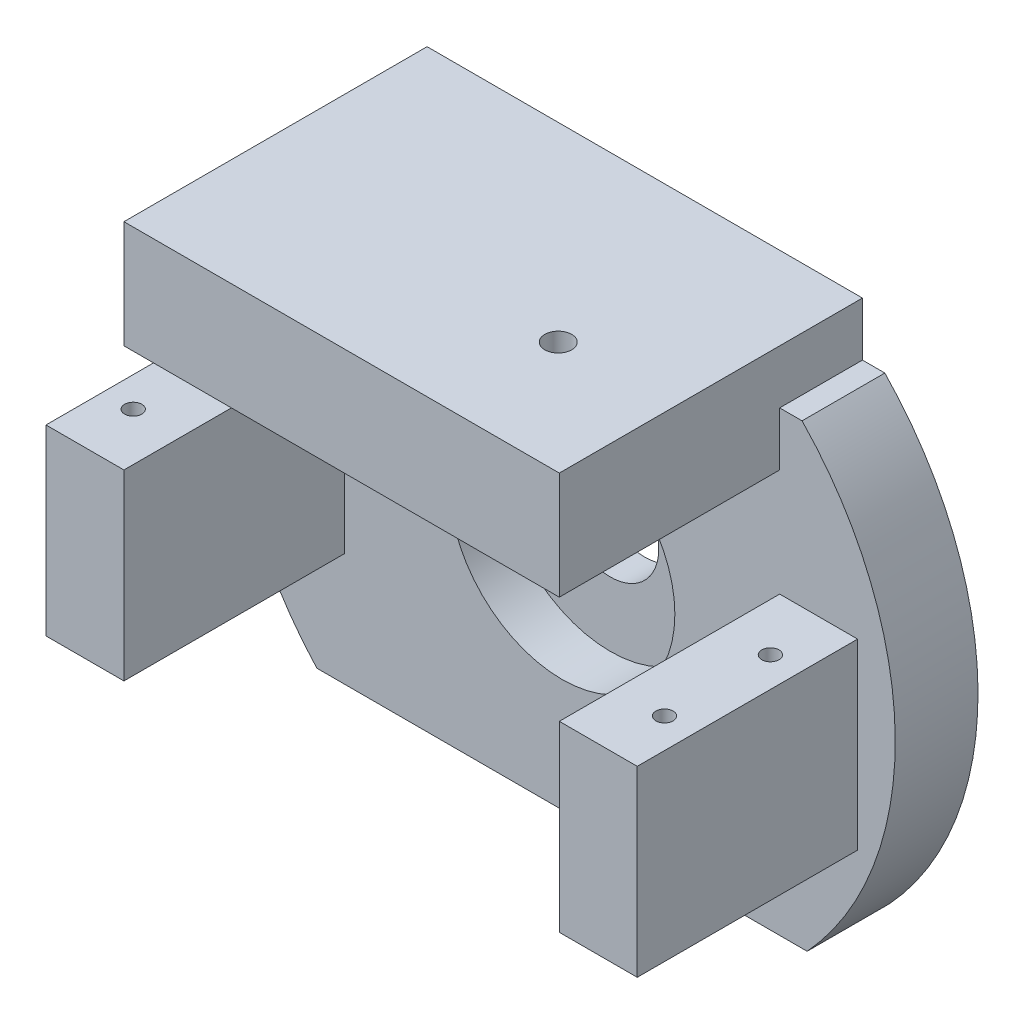
ISO-10303-21;
HEADER;
FILE_DESCRIPTION(('STEP AP214'),'2;1');
FILE_NAME('part.step','',(''),(''),'','','');
FILE_SCHEMA(('AUTOMOTIVE_DESIGN { 1 0 10303 214 1 1 1 1 }'));
ENDSEC;
DATA;
#1=APPLICATION_CONTEXT('core data for automotive mechanical design processes');
#2=APPLICATION_PROTOCOL_DEFINITION('international standard','automotive_design',2000,#1);
#3=PRODUCT_CONTEXT('',#1,'mechanical');
#4=PRODUCT('Part','Part','',(#3));
#5=PRODUCT_RELATED_PRODUCT_CATEGORY('part','',(#4));
#6=PRODUCT_DEFINITION_FORMATION('','',#4);
#7=PRODUCT_DEFINITION_CONTEXT('part definition',#1,'design');
#8=PRODUCT_DEFINITION('design','',#6,#7);
#9=PRODUCT_DEFINITION_SHAPE('','',#8);
#10=(LENGTH_UNIT() NAMED_UNIT(*) SI_UNIT(.MILLI.,.METRE.));
#11=(NAMED_UNIT(*) PLANE_ANGLE_UNIT() SI_UNIT($,.RADIAN.));
#12=(NAMED_UNIT(*) SI_UNIT($,.STERADIAN.) SOLID_ANGLE_UNIT());
#13=UNCERTAINTY_MEASURE_WITH_UNIT(LENGTH_MEASURE(1.E-05),#10,'distance_accuracy_value','');
#14=(GEOMETRIC_REPRESENTATION_CONTEXT(3) GLOBAL_UNCERTAINTY_ASSIGNED_CONTEXT((#13)) GLOBAL_UNIT_ASSIGNED_CONTEXT((#10,
#11,#12)) REPRESENTATION_CONTEXT('',''));
#15=CARTESIAN_POINT('',(0.,0.,0.));
#16=DIRECTION('',(0.,0.,1.));
#17=DIRECTION('',(1.,0.,0.));
#18=AXIS2_PLACEMENT_3D('',#15,#16,#17);
#19=CARTESIAN_POINT('',(-27.5,21.5,27.));
#20=DIRECTION('',(0.,-1.,0.));
#21=DIRECTION('',(0.,0.,-1.));
#22=AXIS2_PLACEMENT_3D('',#19,#20,#21);
#23=PLANE('',#22);
#24=DIRECTION('',(1.,0.,0.));
#25=VECTOR('',#24,1.);
#26=CARTESIAN_POINT('',(-26.0407931939076,21.5,6.5));
#27=LINE('',#26,#25);
#28=CARTESIAN_POINT('',(-22.3327114341273,21.5,6.50000000000001));
#29=VERTEX_POINT('',#28);
#30=CARTESIAN_POINT('',(-20.25,21.5,6.5));
#31=VERTEX_POINT('',#30);
#32=EDGE_CURVE('E180',#29,#31,#27,.T.);
#33=ORIENTED_EDGE('',*,*,#32,.T.);
#34=DIRECTION('',(0.,0.,1.));
#35=VECTOR('',#34,1.);
#36=CARTESIAN_POINT('',(-20.25,21.5,-1.2));
#37=LINE('',#36,#35);
#38=CARTESIAN_POINT('',(-20.25,21.5,-1.2));
#39=VERTEX_POINT('',#38);
#40=EDGE_CURVE('E168',#39,#31,#37,.T.);
#41=ORIENTED_EDGE('',*,*,#40,.F.);
#42=DIRECTION('',(1.,0.,0.));
#43=VECTOR('',#42,1.);
#44=CARTESIAN_POINT('',(22.3327114341273,21.5,-1.2));
#45=LINE('',#44,#43);
#46=CARTESIAN_POINT('',(-22.3327114341273,21.5,-1.2));
#47=VERTEX_POINT('',#46);
#48=EDGE_CURVE('E178',#47,#39,#45,.T.);
#49=ORIENTED_EDGE('',*,*,#48,.F.);
#50=DIRECTION('',(0.,0.,-1.));
#51=VECTOR('',#50,1.);
#52=CARTESIAN_POINT('',(-22.3327114341273,21.5,94.1812408671319));
#53=LINE('',#52,#51);
#54=EDGE_CURVE('E49',#47,#29,#53,.F.);
#55=ORIENTED_EDGE('',*,*,#54,.T.);
#56=EDGE_LOOP('',(#33,#41,#49,#55));
#57=FACE_BOUND('',#56,.T.);
#58=ADVANCED_FACE('F41',(#57),#23,.F.);
#59=CARTESIAN_POINT('',(0.,0.,94.1812408671319));
#60=DIRECTION('',(0.,0.,-1.));
#61=DIRECTION('',(-1.,0.,0.));
#62=AXIS2_PLACEMENT_3D('',#59,#60,#61);
#63=CYLINDRICAL_SURFACE('',#62,31.);
#64=DIRECTION('',(0.,0.,-1.));
#65=VECTOR('',#64,1.);
#66=CARTESIAN_POINT('',(-22.8035085019828,-21.,94.1812408671319));
#67=LINE('',#66,#65);
#68=CARTESIAN_POINT('',(-22.8035085019828,-21.,6.5));
#69=VERTEX_POINT('',#68);
#70=CARTESIAN_POINT('',(-22.8035085019828,-21.,-1.2));
#71=VERTEX_POINT('',#70);
#72=EDGE_CURVE('E63',#69,#71,#67,.T.);
#73=ORIENTED_EDGE('',*,*,#72,.F.);
#74=CARTESIAN_POINT('',(0.,0.,6.50000000000001));
#75=DIRECTION('',(0.,0.,-1.));
#76=DIRECTION('',(-1.,0.,0.));
#77=AXIS2_PLACEMENT_3D('',#74,#75,#76);
#78=CIRCLE('',#77,31.);
#79=EDGE_CURVE('E223',#29,#69,#78,.F.);
#80=ORIENTED_EDGE('',*,*,#79,.F.);
#81=ORIENTED_EDGE('',*,*,#54,.F.);
#82=CARTESIAN_POINT('',(0.,0.,-1.2));
#83=DIRECTION('',(0.,0.,-1.));
#84=DIRECTION('',(-1.,0.,0.));
#85=AXIS2_PLACEMENT_3D('',#82,#83,#84);
#86=CIRCLE('',#85,31.);
#87=EDGE_CURVE('E187',#71,#47,#86,.T.);
#88=ORIENTED_EDGE('',*,*,#87,.F.);
#89=EDGE_LOOP('',(#73,#80,#81,#88));
#90=FACE_BOUND('',#89,.T.);
#91=ADVANCED_FACE('F320',(#90),#63,.T.);
#92=CARTESIAN_POINT('',(-20.25,67.4360851344404,6.5));
#93=DIRECTION('',(0.,0.,-1.));
#94=DIRECTION('',(-1.,0.,0.));
#95=AXIS2_PLACEMENT_3D('',#92,#93,#94);
#96=PLANE('',#95);
#97=CARTESIAN_POINT('',(0.,0.,6.5));
#98=DIRECTION('',(0.,0.,1.));
#99=DIRECTION('',(1.,0.,0.));
#100=AXIS2_PLACEMENT_3D('',#97,#98,#99);
#101=CIRCLE('',#100,10.5);
#102=CARTESIAN_POINT('',(10.5,0.,6.5));
#103=VERTEX_POINT('',#102);
#104=EDGE_CURVE('E201',#103,#103,#101,.T.);
#105=ORIENTED_EDGE('',*,*,#104,.F.);
#106=EDGE_LOOP('',(#105));
#107=FACE_BOUND('',#106,.T.);
#108=DIRECTION('',(-1.,0.,0.));
#109=VECTOR('',#108,1.);
#110=CARTESIAN_POINT('',(50.3089894559141,6.50000000000001,6.5));
#111=LINE('',#110,#109);
#112=CARTESIAN_POINT('',(27.5,6.50000000000001,6.5));
#113=VERTEX_POINT('',#112);
#114=CARTESIAN_POINT('',(20.25,6.50000000000001,6.5));
#115=VERTEX_POINT('',#114);
#116=EDGE_CURVE('E254',#113,#115,#111,.T.);
#117=ORIENTED_EDGE('',*,*,#116,.F.);
#118=DIRECTION('',(0.,-1.,0.));
#119=VECTOR('',#118,1.);
#120=CARTESIAN_POINT('',(27.5,21.5,6.5));
#121=LINE('',#120,#119);
#122=CARTESIAN_POINT('',(27.5,-10.5,6.5));
#123=VERTEX_POINT('',#122);
#124=EDGE_CURVE('E226',#113,#123,#121,.T.);
#125=ORIENTED_EDGE('',*,*,#124,.T.);
#126=DIRECTION('',(-1.,0.,0.));
#127=VECTOR('',#126,1.);
#128=CARTESIAN_POINT('',(-27.5,-10.5,6.5));
#129=LINE('',#128,#127);
#130=CARTESIAN_POINT('',(20.25,-10.5,6.5));
#131=VERTEX_POINT('',#130);
#132=EDGE_CURVE('E275',#123,#131,#129,.T.);
#133=ORIENTED_EDGE('',*,*,#132,.T.);
#134=DIRECTION('',(0.,-1.,0.));
#135=VECTOR('',#134,1.);
#136=CARTESIAN_POINT('',(20.25,67.4360851344404,6.5));
#137=LINE('',#136,#135);
#138=EDGE_CURVE('E285',#115,#131,#137,.T.);
#139=ORIENTED_EDGE('',*,*,#138,.F.);
#140=EDGE_LOOP('',(#117,#125,#133,#139));
#141=FACE_BOUND('',#140,.T.);
#142=ORIENTED_EDGE('',*,*,#79,.T.);
#143=DIRECTION('',(-1.,0.,0.));
#144=VECTOR('',#143,1.);
#145=CARTESIAN_POINT('',(26.5027413784262,-21.,6.5));
#146=LINE('',#145,#144);
#147=CARTESIAN_POINT('',(22.8035085019828,-21.,6.5));
#148=VERTEX_POINT('',#147);
#149=EDGE_CURVE('E322',#148,#69,#146,.T.);
#150=ORIENTED_EDGE('',*,*,#149,.F.);
#151=CARTESIAN_POINT('',(22.3327114341273,21.5,6.50000000000001));
#152=VERTEX_POINT('',#151);
#153=EDGE_CURVE('E227',#148,#152,#78,.F.);
#154=ORIENTED_EDGE('',*,*,#153,.T.);
#155=CARTESIAN_POINT('',(20.25,21.5,6.5));
#156=VERTEX_POINT('',#155);
#157=EDGE_CURVE('E189',#156,#152,#27,.T.);
#158=ORIENTED_EDGE('',*,*,#157,.F.);
#159=DIRECTION('',(0.,-1.,0.));
#160=VECTOR('',#159,1.);
#161=CARTESIAN_POINT('',(20.25,43.2442521140645,6.5));
#162=LINE('',#161,#160);
#163=CARTESIAN_POINT('',(20.25,16.5,6.5));
#164=VERTEX_POINT('',#163);
#165=EDGE_CURVE('E243',#156,#164,#162,.T.);
#166=ORIENTED_EDGE('',*,*,#165,.T.);
#167=DIRECTION('',(-1.,0.,0.));
#168=VECTOR('',#167,1.);
#169=CARTESIAN_POINT('',(-20.25,16.5,6.5));
#170=LINE('',#169,#168);
#171=CARTESIAN_POINT('',(-20.25,16.5,6.5));
#172=VERTEX_POINT('',#171);
#173=EDGE_CURVE('E287',#164,#172,#170,.T.);
#174=ORIENTED_EDGE('',*,*,#173,.T.);
#175=DIRECTION('',(0.,-1.,0.));
#176=VECTOR('',#175,1.);
#177=CARTESIAN_POINT('',(-20.25,43.2442521140645,6.5));
#178=LINE('',#177,#176);
#179=EDGE_CURVE('E235',#31,#172,#178,.T.);
#180=ORIENTED_EDGE('',*,*,#179,.F.);
#181=ORIENTED_EDGE('',*,*,#32,.F.);
#182=EDGE_LOOP('',(#142,#150,#154,#158,#166,#174,#180,#181));
#183=FACE_BOUND('',#182,.T.);
#184=CARTESIAN_POINT('',(-20.25,-10.5,6.5));
#185=VERTEX_POINT('',#184);
#186=CARTESIAN_POINT('',(-27.5,-10.5,6.5));
#187=VERTEX_POINT('',#186);
#188=EDGE_CURVE('E274',#185,#187,#129,.T.);
#189=ORIENTED_EDGE('',*,*,#188,.T.);
#190=DIRECTION('',(0.,1.,0.));
#191=VECTOR('',#190,1.);
#192=CARTESIAN_POINT('',(-27.5,21.5,6.5));
#193=LINE('',#192,#191);
#194=CARTESIAN_POINT('',(-27.5,6.5,6.5));
#195=VERTEX_POINT('',#194);
#196=EDGE_CURVE('E230',#187,#195,#193,.T.);
#197=ORIENTED_EDGE('',*,*,#196,.T.);
#198=CARTESIAN_POINT('',(-20.25,6.5,6.5));
#199=VERTEX_POINT('',#198);
#200=EDGE_CURVE('E248',#199,#195,#111,.T.);
#201=ORIENTED_EDGE('',*,*,#200,.F.);
#202=DIRECTION('',(0.,-1.,0.));
#203=VECTOR('',#202,1.);
#204=CARTESIAN_POINT('',(-20.25,67.4360851344404,6.5));
#205=LINE('',#204,#203);
#206=EDGE_CURVE('E284',#199,#185,#205,.T.);
#207=ORIENTED_EDGE('',*,*,#206,.T.);
#208=EDGE_LOOP('',(#189,#197,#201,#207));
#209=FACE_BOUND('',#208,.T.);
#210=ADVANCED_FACE('F317',(#107,#141,#183,#209),#96,.F.);
#211=CARTESIAN_POINT('',(27.5,21.5,27.));
#212=DIRECTION('',(-1.,0.,0.));
#213=DIRECTION('',(0.,-1.,0.));
#214=AXIS2_PLACEMENT_3D('',#211,#212,#213);
#215=PLANE('',#214);
#216=ORIENTED_EDGE('',*,*,#124,.F.);
#217=DIRECTION('',(0.,0.,-1.));
#218=VECTOR('',#217,1.);
#219=CARTESIAN_POINT('',(27.5,6.50000000000001,6.5));
#220=LINE('',#219,#218);
#221=CARTESIAN_POINT('',(27.5,6.50000000000001,27.));
#222=VERTEX_POINT('',#221);
#223=EDGE_CURVE('E252',#222,#113,#220,.T.);
#224=ORIENTED_EDGE('',*,*,#223,.F.);
#225=DIRECTION('',(0.,1.,0.));
#226=VECTOR('',#225,1.);
#227=CARTESIAN_POINT('',(27.5,21.5,27.));
#228=LINE('',#227,#226);
#229=CARTESIAN_POINT('',(27.5,-10.5,27.));
#230=VERTEX_POINT('',#229);
#231=EDGE_CURVE('E291',#230,#222,#228,.T.);
#232=ORIENTED_EDGE('',*,*,#231,.F.);
#233=DIRECTION('',(0.,0.,-1.));
#234=VECTOR('',#233,1.);
#235=CARTESIAN_POINT('',(27.5,-10.5,27.));
#236=LINE('',#235,#234);
#237=EDGE_CURVE('E264',#230,#123,#236,.T.);
#238=ORIENTED_EDGE('',*,*,#237,.T.);
#239=EDGE_LOOP('',(#216,#224,#232,#238));
#240=FACE_BOUND('',#239,.T.);
#241=ADVANCED_FACE('F43',(#240),#215,.F.);
#242=CARTESIAN_POINT('',(20.25,21.5,-1.2));
#243=VERTEX_POINT('',#242);
#244=CARTESIAN_POINT('',(22.3327114341273,21.5,-1.2));
#245=VERTEX_POINT('',#244);
#246=EDGE_CURVE('E190',#243,#245,#45,.T.);
#247=ORIENTED_EDGE('',*,*,#246,.F.);
#248=DIRECTION('',(0.,0.,1.));
#249=VECTOR('',#248,1.);
#250=CARTESIAN_POINT('',(20.25,21.5,-1.2));
#251=LINE('',#250,#249);
#252=EDGE_CURVE('E182',#243,#156,#251,.T.);
#253=ORIENTED_EDGE('',*,*,#252,.T.);
#254=ORIENTED_EDGE('',*,*,#157,.T.);
#255=DIRECTION('',(0.,0.,-1.));
#256=VECTOR('',#255,1.);
#257=CARTESIAN_POINT('',(22.3327114341273,21.5,94.1812408671319));
#258=LINE('',#257,#256);
#259=EDGE_CURVE('E304',#152,#245,#258,.T.);
#260=ORIENTED_EDGE('',*,*,#259,.T.);
#261=EDGE_LOOP('',(#247,#253,#254,#260));
#262=FACE_BOUND('',#261,.T.);
#263=ADVANCED_FACE('F363',(#262),#23,.F.);
#264=CARTESIAN_POINT('',(-27.5,21.5,27.));
#265=DIRECTION('',(1.,0.,0.));
#266=DIRECTION('',(0.,1.,0.));
#267=AXIS2_PLACEMENT_3D('',#264,#265,#266);
#268=PLANE('',#267);
#269=ORIENTED_EDGE('',*,*,#196,.F.);
#270=DIRECTION('',(0.,0.,1.));
#271=VECTOR('',#270,1.);
#272=CARTESIAN_POINT('',(-27.5,-10.5,27.));
#273=LINE('',#272,#271);
#274=CARTESIAN_POINT('',(-27.5,-10.5,27.));
#275=VERTEX_POINT('',#274);
#276=EDGE_CURVE('E271',#187,#275,#273,.T.);
#277=ORIENTED_EDGE('',*,*,#276,.T.);
#278=DIRECTION('',(0.,-1.,0.));
#279=VECTOR('',#278,1.);
#280=CARTESIAN_POINT('',(-27.5,21.5,27.));
#281=LINE('',#280,#279);
#282=CARTESIAN_POINT('',(-27.5,6.5,27.));
#283=VERTEX_POINT('',#282);
#284=EDGE_CURVE('E294',#283,#275,#281,.T.);
#285=ORIENTED_EDGE('',*,*,#284,.F.);
#286=DIRECTION('',(0.,0.,1.));
#287=VECTOR('',#286,1.);
#288=CARTESIAN_POINT('',(-27.5,6.5,6.5));
#289=LINE('',#288,#287);
#290=EDGE_CURVE('E240',#195,#283,#289,.T.);
#291=ORIENTED_EDGE('',*,*,#290,.F.);
#292=EDGE_LOOP('',(#269,#277,#285,#291));
#293=FACE_BOUND('',#292,.T.);
#294=ADVANCED_FACE('F398',(#293),#268,.F.);
#295=CARTESIAN_POINT('',(0.,0.,27.));
#296=DIRECTION('',(0.,0.,1.));
#297=DIRECTION('',(1.,0.,0.));
#298=AXIS2_PLACEMENT_3D('',#295,#296,#297);
#299=PLANE('',#298);
#300=DIRECTION('',(0.,-1.,0.));
#301=VECTOR('',#300,1.);
#302=CARTESIAN_POINT('',(-20.25,43.2442521140645,27.));
#303=LINE('',#302,#301);
#304=CARTESIAN_POINT('',(-20.25,26.5,27.));
#305=VERTEX_POINT('',#304);
#306=CARTESIAN_POINT('',(-20.25,16.5,27.));
#307=VERTEX_POINT('',#306);
#308=EDGE_CURVE('E237',#305,#307,#303,.T.);
#309=ORIENTED_EDGE('',*,*,#308,.T.);
#310=DIRECTION('',(1.,0.,0.));
#311=VECTOR('',#310,1.);
#312=CARTESIAN_POINT('',(0.,16.5,27.));
#313=LINE('',#312,#311);
#314=CARTESIAN_POINT('',(20.25,16.5,27.));
#315=VERTEX_POINT('',#314);
#316=EDGE_CURVE('E296',#307,#315,#313,.T.);
#317=ORIENTED_EDGE('',*,*,#316,.T.);
#318=DIRECTION('',(0.,-1.,0.));
#319=VECTOR('',#318,1.);
#320=CARTESIAN_POINT('',(20.25,43.2442521140645,27.));
#321=LINE('',#320,#319);
#322=CARTESIAN_POINT('',(20.25,26.5,27.));
#323=VERTEX_POINT('',#322);
#324=EDGE_CURVE('E236',#323,#315,#321,.T.);
#325=ORIENTED_EDGE('',*,*,#324,.F.);
#326=DIRECTION('',(-1.,0.,0.));
#327=VECTOR('',#326,1.);
#328=CARTESIAN_POINT('',(-20.25,26.5,27.));
#329=LINE('',#328,#327);
#330=EDGE_CURVE('E174',#323,#305,#329,.T.);
#331=ORIENTED_EDGE('',*,*,#330,.T.);
#332=EDGE_LOOP('',(#309,#317,#325,#331));
#333=FACE_BOUND('',#332,.T.);
#334=ADVANCED_FACE('F354',(#333),#299,.T.);
#335=DIRECTION('',(-1.,0.,0.));
#336=VECTOR('',#335,1.);
#337=CARTESIAN_POINT('',(50.3089894559141,6.50000000000001,27.));
#338=LINE('',#337,#336);
#339=CARTESIAN_POINT('',(-20.25,6.5,27.));
#340=VERTEX_POINT('',#339);
#341=EDGE_CURVE('E253',#340,#283,#338,.T.);
#342=ORIENTED_EDGE('',*,*,#341,.T.);
#343=ORIENTED_EDGE('',*,*,#284,.T.);
#344=DIRECTION('',(1.,0.,0.));
#345=VECTOR('',#344,1.);
#346=CARTESIAN_POINT('',(-27.5,-10.5,27.));
#347=LINE('',#346,#345);
#348=CARTESIAN_POINT('',(-20.25,-10.5,27.));
#349=VERTEX_POINT('',#348);
#350=EDGE_CURVE('E268',#275,#349,#347,.T.);
#351=ORIENTED_EDGE('',*,*,#350,.T.);
#352=DIRECTION('',(0.,-1.,0.));
#353=VECTOR('',#352,1.);
#354=CARTESIAN_POINT('',(-20.25,0.,27.));
#355=LINE('',#354,#353);
#356=EDGE_CURVE('E302',#340,#349,#355,.T.);
#357=ORIENTED_EDGE('',*,*,#356,.F.);
#358=EDGE_LOOP('',(#342,#343,#351,#357));
#359=FACE_BOUND('',#358,.T.);
#360=ADVANCED_FACE('F424',(#359),#299,.T.);
#361=CARTESIAN_POINT('',(20.25,6.50000000000001,27.));
#362=VERTEX_POINT('',#361);
#363=EDGE_CURVE('E249',#222,#362,#338,.T.);
#364=ORIENTED_EDGE('',*,*,#363,.T.);
#365=DIRECTION('',(0.,1.,0.));
#366=VECTOR('',#365,1.);
#367=CARTESIAN_POINT('',(20.25,0.,27.));
#368=LINE('',#367,#366);
#369=CARTESIAN_POINT('',(20.25,-10.5,27.));
#370=VERTEX_POINT('',#369);
#371=EDGE_CURVE('E299',#370,#362,#368,.T.);
#372=ORIENTED_EDGE('',*,*,#371,.F.);
#373=EDGE_CURVE('E267',#370,#230,#347,.T.);
#374=ORIENTED_EDGE('',*,*,#373,.T.);
#375=ORIENTED_EDGE('',*,*,#231,.T.);
#376=EDGE_LOOP('',(#364,#372,#374,#375));
#377=FACE_BOUND('',#376,.T.);
#378=ADVANCED_FACE('F422',(#377),#299,.T.);
#379=CARTESIAN_POINT('',(-20.25,67.4360851344404,6.5));
#380=DIRECTION('',(-1.,0.,0.));
#381=DIRECTION('',(0.,0.,1.));
#382=AXIS2_PLACEMENT_3D('',#379,#380,#381);
#383=PLANE('',#382);
#384=ORIENTED_EDGE('',*,*,#206,.F.);
#385=DIRECTION('',(0.,0.,1.));
#386=VECTOR('',#385,1.);
#387=CARTESIAN_POINT('',(-20.25,6.5,6.5));
#388=LINE('',#387,#386);
#389=EDGE_CURVE('E261',#199,#340,#388,.T.);
#390=ORIENTED_EDGE('',*,*,#389,.T.);
#391=ORIENTED_EDGE('',*,*,#356,.T.);
#392=DIRECTION('',(0.,0.,1.));
#393=VECTOR('',#392,1.);
#394=CARTESIAN_POINT('',(-20.25,-10.5,6.5));
#395=LINE('',#394,#393);
#396=EDGE_CURVE('E281',#185,#349,#395,.T.);
#397=ORIENTED_EDGE('',*,*,#396,.F.);
#398=EDGE_LOOP('',(#384,#390,#391,#397));
#399=FACE_BOUND('',#398,.T.);
#400=ADVANCED_FACE('F387',(#399),#383,.F.);
#401=CARTESIAN_POINT('',(20.25,67.4360851344404,6.5));
#402=DIRECTION('',(1.,0.,0.));
#403=DIRECTION('',(0.,0.,-1.));
#404=AXIS2_PLACEMENT_3D('',#401,#402,#403);
#405=PLANE('',#404);
#406=ORIENTED_EDGE('',*,*,#371,.T.);
#407=DIRECTION('',(0.,0.,-1.));
#408=VECTOR('',#407,1.);
#409=CARTESIAN_POINT('',(20.25,6.50000000000001,6.5));
#410=LINE('',#409,#408);
#411=EDGE_CURVE('E258',#362,#115,#410,.T.);
#412=ORIENTED_EDGE('',*,*,#411,.T.);
#413=ORIENTED_EDGE('',*,*,#138,.T.);
#414=DIRECTION('',(0.,0.,-1.));
#415=VECTOR('',#414,1.);
#416=CARTESIAN_POINT('',(20.25,-10.5,6.5));
#417=LINE('',#416,#415);
#418=EDGE_CURVE('E278',#370,#131,#417,.T.);
#419=ORIENTED_EDGE('',*,*,#418,.F.);
#420=EDGE_LOOP('',(#406,#412,#413,#419));
#421=FACE_BOUND('',#420,.T.);
#422=ADVANCED_FACE('F377',(#421),#405,.F.);
#423=CARTESIAN_POINT('',(-27.5,16.5,27.));
#424=DIRECTION('',(0.,-1.,0.));
#425=DIRECTION('',(0.,0.,-1.));
#426=AXIS2_PLACEMENT_3D('',#423,#424,#425);
#427=PLANE('',#426);
#428=CARTESIAN_POINT('',(9.65,16.5,16.5));
#429=DIRECTION('',(0.,-1.,0.));
#430=DIRECTION('',(0.,0.,-1.));
#431=AXIS2_PLACEMENT_3D('',#428,#429,#430);
#432=CIRCLE('',#431,1.24999999999999);
#433=CARTESIAN_POINT('',(9.65,16.5,15.25));
#434=VERTEX_POINT('',#433);
#435=EDGE_CURVE('E336',#434,#434,#432,.T.);
#436=ORIENTED_EDGE('',*,*,#435,.F.);
#437=EDGE_LOOP('',(#436));
#438=FACE_BOUND('',#437,.T.);
#439=DIRECTION('',(0.,0.,1.));
#440=VECTOR('',#439,1.);
#441=CARTESIAN_POINT('',(-20.25,16.5,27.));
#442=LINE('',#441,#440);
#443=EDGE_CURVE('E233',#172,#307,#442,.T.);
#444=ORIENTED_EDGE('',*,*,#443,.F.);
#445=ORIENTED_EDGE('',*,*,#173,.F.);
#446=DIRECTION('',(0.,0.,-1.));
#447=VECTOR('',#446,1.);
#448=CARTESIAN_POINT('',(20.25,16.5,27.));
#449=LINE('',#448,#447);
#450=EDGE_CURVE('E232',#315,#164,#449,.T.);
#451=ORIENTED_EDGE('',*,*,#450,.F.);
#452=ORIENTED_EDGE('',*,*,#316,.F.);
#453=EDGE_LOOP('',(#444,#445,#451,#452));
#454=FACE_BOUND('',#453,.T.);
#455=ADVANCED_FACE('F374',(#438,#454),#427,.T.);
#456=CARTESIAN_POINT('',(-27.5,-10.5,27.));
#457=DIRECTION('',(0.,-1.,0.));
#458=DIRECTION('',(0.,0.,-1.));
#459=AXIS2_PLACEMENT_3D('',#456,#457,#458);
#460=PLANE('',#459);
#461=CARTESIAN_POINT('',(24.71,-10.5,21.675));
#462=DIRECTION('',(0.,-1.,0.));
#463=DIRECTION('',(0.,0.,-1.));
#464=AXIS2_PLACEMENT_3D('',#461,#462,#463);
#465=CIRCLE('',#464,0.799999999999995);
#466=CARTESIAN_POINT('',(24.71,-10.5,20.875));
#467=VERTEX_POINT('',#466);
#468=EDGE_CURVE('E215',#467,#467,#465,.T.);
#469=ORIENTED_EDGE('',*,*,#468,.F.);
#470=EDGE_LOOP('',(#469));
#471=FACE_BOUND('',#470,.T.);
#472=CARTESIAN_POINT('',(24.71,-10.5,11.825));
#473=DIRECTION('',(0.,-1.,0.));
#474=DIRECTION('',(0.,0.,-1.));
#475=AXIS2_PLACEMENT_3D('',#472,#473,#474);
#476=CIRCLE('',#475,0.799999999999995);
#477=CARTESIAN_POINT('',(24.71,-10.5,11.025));
#478=VERTEX_POINT('',#477);
#479=EDGE_CURVE('E219',#478,#478,#476,.T.);
#480=ORIENTED_EDGE('',*,*,#479,.F.);
#481=EDGE_LOOP('',(#480));
#482=FACE_BOUND('',#481,.T.);
#483=ORIENTED_EDGE('',*,*,#418,.T.);
#484=ORIENTED_EDGE('',*,*,#132,.F.);
#485=ORIENTED_EDGE('',*,*,#237,.F.);
#486=ORIENTED_EDGE('',*,*,#373,.F.);
#487=EDGE_LOOP('',(#483,#484,#485,#486));
#488=FACE_BOUND('',#487,.T.);
#489=ADVANCED_FACE('F376',(#471,#482,#488),#460,.T.);
#490=CARTESIAN_POINT('',(-24.71,-10.5,21.675));
#491=DIRECTION('',(0.,-1.,0.));
#492=DIRECTION('',(0.,0.,-1.));
#493=AXIS2_PLACEMENT_3D('',#490,#491,#492);
#494=CIRCLE('',#493,0.799999999999995);
#495=CARTESIAN_POINT('',(-24.71,-10.5,20.875));
#496=VERTEX_POINT('',#495);
#497=EDGE_CURVE('E207',#496,#496,#494,.T.);
#498=ORIENTED_EDGE('',*,*,#497,.F.);
#499=EDGE_LOOP('',(#498));
#500=FACE_BOUND('',#499,.T.);
#501=CARTESIAN_POINT('',(-24.71,-10.5,11.825));
#502=DIRECTION('',(0.,-1.,0.));
#503=DIRECTION('',(0.,0.,-1.));
#504=AXIS2_PLACEMENT_3D('',#501,#502,#503);
#505=CIRCLE('',#504,0.799999999999995);
#506=CARTESIAN_POINT('',(-24.71,-10.5,11.025));
#507=VERTEX_POINT('',#506);
#508=EDGE_CURVE('E211',#507,#507,#505,.T.);
#509=ORIENTED_EDGE('',*,*,#508,.F.);
#510=EDGE_LOOP('',(#509));
#511=FACE_BOUND('',#510,.T.);
#512=ORIENTED_EDGE('',*,*,#396,.T.);
#513=ORIENTED_EDGE('',*,*,#350,.F.);
#514=ORIENTED_EDGE('',*,*,#276,.F.);
#515=ORIENTED_EDGE('',*,*,#188,.F.);
#516=EDGE_LOOP('',(#512,#513,#514,#515));
#517=FACE_BOUND('',#516,.T.);
#518=ADVANCED_FACE('F384',(#500,#511,#517),#460,.T.);
#519=CARTESIAN_POINT('',(50.3089894559141,6.50000000000001,6.5));
#520=DIRECTION('',(0.,-1.,0.));
#521=DIRECTION('',(1.,0.,0.));
#522=AXIS2_PLACEMENT_3D('',#519,#520,#521);
#523=PLANE('',#522);
#524=CARTESIAN_POINT('',(-24.71,6.5,21.675));
#525=DIRECTION('',(0.,-1.,0.));
#526=DIRECTION('',(1.,0.,0.));
#527=AXIS2_PLACEMENT_3D('',#524,#525,#526);
#528=CIRCLE('',#527,0.799999999999993);
#529=CARTESIAN_POINT('',(-23.91,6.5,21.675));
#530=VERTEX_POINT('',#529);
#531=EDGE_CURVE('E210',#530,#530,#528,.T.);
#532=ORIENTED_EDGE('',*,*,#531,.T.);
#533=EDGE_LOOP('',(#532));
#534=FACE_BOUND('',#533,.T.);
#535=CARTESIAN_POINT('',(-24.71,6.5,11.825));
#536=DIRECTION('',(0.,-1.,0.));
#537=DIRECTION('',(1.,0.,0.));
#538=AXIS2_PLACEMENT_3D('',#535,#536,#537);
#539=CIRCLE('',#538,0.799999999999993);
#540=CARTESIAN_POINT('',(-23.91,6.5,11.825));
#541=VERTEX_POINT('',#540);
#542=EDGE_CURVE('E214',#541,#541,#539,.T.);
#543=ORIENTED_EDGE('',*,*,#542,.T.);
#544=EDGE_LOOP('',(#543));
#545=FACE_BOUND('',#544,.T.);
#546=ORIENTED_EDGE('',*,*,#200,.T.);
#547=ORIENTED_EDGE('',*,*,#290,.T.);
#548=ORIENTED_EDGE('',*,*,#341,.F.);
#549=ORIENTED_EDGE('',*,*,#389,.F.);
#550=EDGE_LOOP('',(#546,#547,#548,#549));
#551=FACE_BOUND('',#550,.T.);
#552=ADVANCED_FACE('F492',(#534,#545,#551),#523,.F.);
#553=CARTESIAN_POINT('',(24.71,6.50000000000001,21.675));
#554=DIRECTION('',(0.,-1.,0.));
#555=DIRECTION('',(1.,0.,0.));
#556=AXIS2_PLACEMENT_3D('',#553,#554,#555);
#557=CIRCLE('',#556,0.799999999999993);
#558=CARTESIAN_POINT('',(25.51,6.50000000000001,21.675));
#559=VERTEX_POINT('',#558);
#560=EDGE_CURVE('E218',#559,#559,#557,.T.);
#561=ORIENTED_EDGE('',*,*,#560,.T.);
#562=EDGE_LOOP('',(#561));
#563=FACE_BOUND('',#562,.T.);
#564=CARTESIAN_POINT('',(24.71,6.50000000000001,11.825));
#565=DIRECTION('',(0.,-1.,0.));
#566=DIRECTION('',(1.,0.,0.));
#567=AXIS2_PLACEMENT_3D('',#564,#565,#566);
#568=CIRCLE('',#567,0.799999999999993);
#569=CARTESIAN_POINT('',(25.51,6.50000000000001,11.825));
#570=VERTEX_POINT('',#569);
#571=EDGE_CURVE('E222',#570,#570,#568,.T.);
#572=ORIENTED_EDGE('',*,*,#571,.T.);
#573=EDGE_LOOP('',(#572));
#574=FACE_BOUND('',#573,.T.);
#575=ORIENTED_EDGE('',*,*,#363,.F.);
#576=ORIENTED_EDGE('',*,*,#223,.T.);
#577=ORIENTED_EDGE('',*,*,#116,.T.);
#578=ORIENTED_EDGE('',*,*,#411,.F.);
#579=EDGE_LOOP('',(#575,#576,#577,#578));
#580=FACE_BOUND('',#579,.T.);
#581=ADVANCED_FACE('F415',(#563,#574,#580),#523,.F.);
#582=CARTESIAN_POINT('',(20.25,43.2442521140645,27.));
#583=DIRECTION('',(-1.,0.,0.));
#584=DIRECTION('',(0.,0.,1.));
#585=AXIS2_PLACEMENT_3D('',#582,#583,#584);
#586=PLANE('',#585);
#587=ORIENTED_EDGE('',*,*,#165,.F.);
#588=ORIENTED_EDGE('',*,*,#252,.F.);
#589=DIRECTION('',(0.,1.,0.));
#590=VECTOR('',#589,1.);
#591=CARTESIAN_POINT('',(20.25,21.5,-1.2));
#592=LINE('',#591,#590);
#593=CARTESIAN_POINT('',(20.25,26.5,-1.2));
#594=VERTEX_POINT('',#593);
#595=EDGE_CURVE('E56',#243,#594,#592,.T.);
#596=ORIENTED_EDGE('',*,*,#595,.T.);
#597=DIRECTION('',(0.,0.,1.));
#598=VECTOR('',#597,1.);
#599=CARTESIAN_POINT('',(20.25,26.5,-1.2));
#600=LINE('',#599,#598);
#601=EDGE_CURVE('E330',#594,#323,#600,.T.);
#602=ORIENTED_EDGE('',*,*,#601,.T.);
#603=ORIENTED_EDGE('',*,*,#324,.T.);
#604=ORIENTED_EDGE('',*,*,#450,.T.);
#605=EDGE_LOOP('',(#587,#588,#596,#602,#603,#604));
#606=FACE_BOUND('',#605,.T.);
#607=ADVANCED_FACE('F359',(#606),#586,.F.);
#608=CARTESIAN_POINT('',(-20.25,43.2442521140645,27.));
#609=DIRECTION('',(1.,0.,0.));
#610=DIRECTION('',(0.,0.,-1.));
#611=AXIS2_PLACEMENT_3D('',#608,#609,#610);
#612=PLANE('',#611);
#613=ORIENTED_EDGE('',*,*,#308,.F.);
#614=DIRECTION('',(0.,0.,1.));
#615=VECTOR('',#614,1.);
#616=CARTESIAN_POINT('',(-20.25,26.5,-1.2));
#617=LINE('',#616,#615);
#618=CARTESIAN_POINT('',(-20.25,26.5,-1.2));
#619=VERTEX_POINT('',#618);
#620=EDGE_CURVE('E171',#619,#305,#617,.T.);
#621=ORIENTED_EDGE('',*,*,#620,.F.);
#622=DIRECTION('',(0.,-1.,0.));
#623=VECTOR('',#622,1.);
#624=CARTESIAN_POINT('',(-20.25,21.5,-1.2));
#625=LINE('',#624,#623);
#626=EDGE_CURVE('E165',#619,#39,#625,.T.);
#627=ORIENTED_EDGE('',*,*,#626,.T.);
#628=ORIENTED_EDGE('',*,*,#40,.T.);
#629=ORIENTED_EDGE('',*,*,#179,.T.);
#630=ORIENTED_EDGE('',*,*,#443,.T.);
#631=EDGE_LOOP('',(#613,#621,#627,#628,#629,#630));
#632=FACE_BOUND('',#631,.T.);
#633=ADVANCED_FACE('F167',(#632),#612,.F.);
#634=DIRECTION('',(0.,0.,-1.));
#635=VECTOR('',#634,1.);
#636=CARTESIAN_POINT('',(22.8035085019828,-21.,94.1812408671319));
#637=LINE('',#636,#635);
#638=CARTESIAN_POINT('',(22.8035085019828,-21.,-1.2));
#639=VERTEX_POINT('',#638);
#640=EDGE_CURVE('E321',#639,#148,#637,.F.);
#641=ORIENTED_EDGE('',*,*,#640,.F.);
#642=EDGE_CURVE('E194',#245,#639,#86,.T.);
#643=ORIENTED_EDGE('',*,*,#642,.F.);
#644=ORIENTED_EDGE('',*,*,#259,.F.);
#645=ORIENTED_EDGE('',*,*,#153,.F.);
#646=EDGE_LOOP('',(#641,#643,#644,#645));
#647=FACE_BOUND('',#646,.T.);
#648=ADVANCED_FACE('F369',(#647),#63,.T.);
#649=CARTESIAN_POINT('',(24.71,-10.5,11.825));
#650=DIRECTION('',(0.,-1.,0.));
#651=DIRECTION('',(0.,0.,-1.));
#652=AXIS2_PLACEMENT_3D('',#649,#650,#651);
#653=CYLINDRICAL_SURFACE('',#652,0.799999999999993);
#654=ORIENTED_EDGE('',*,*,#479,.T.);
#655=EDGE_LOOP('',(#654));
#656=FACE_BOUND('',#655,.T.);
#657=ORIENTED_EDGE('',*,*,#571,.F.);
#658=EDGE_LOOP('',(#657));
#659=FACE_BOUND('',#658,.T.);
#660=ADVANCED_FACE('F520',(#656,#659),#653,.F.);
#661=CARTESIAN_POINT('',(24.71,-10.5,21.675));
#662=DIRECTION('',(0.,-1.,0.));
#663=DIRECTION('',(0.,0.,-1.));
#664=AXIS2_PLACEMENT_3D('',#661,#662,#663);
#665=CYLINDRICAL_SURFACE('',#664,0.799999999999993);
#666=ORIENTED_EDGE('',*,*,#468,.T.);
#667=EDGE_LOOP('',(#666));
#668=FACE_BOUND('',#667,.T.);
#669=ORIENTED_EDGE('',*,*,#560,.F.);
#670=EDGE_LOOP('',(#669));
#671=FACE_BOUND('',#670,.T.);
#672=ADVANCED_FACE('F526',(#668,#671),#665,.F.);
#673=CARTESIAN_POINT('',(-24.71,-10.5,11.825));
#674=DIRECTION('',(0.,-1.,0.));
#675=DIRECTION('',(0.,0.,-1.));
#676=AXIS2_PLACEMENT_3D('',#673,#674,#675);
#677=CYLINDRICAL_SURFACE('',#676,0.799999999999993);
#678=ORIENTED_EDGE('',*,*,#508,.T.);
#679=EDGE_LOOP('',(#678));
#680=FACE_BOUND('',#679,.T.);
#681=ORIENTED_EDGE('',*,*,#542,.F.);
#682=EDGE_LOOP('',(#681));
#683=FACE_BOUND('',#682,.T.);
#684=ADVANCED_FACE('F538',(#680,#683),#677,.F.);
#685=CARTESIAN_POINT('',(-24.71,-10.5,21.675));
#686=DIRECTION('',(0.,-1.,0.));
#687=DIRECTION('',(0.,0.,-1.));
#688=AXIS2_PLACEMENT_3D('',#685,#686,#687);
#689=CYLINDRICAL_SURFACE('',#688,0.799999999999993);
#690=ORIENTED_EDGE('',*,*,#497,.T.);
#691=EDGE_LOOP('',(#690));
#692=FACE_BOUND('',#691,.T.);
#693=ORIENTED_EDGE('',*,*,#531,.F.);
#694=EDGE_LOOP('',(#693));
#695=FACE_BOUND('',#694,.T.);
#696=ADVANCED_FACE('F549',(#692,#695),#689,.F.);
#697=CARTESIAN_POINT('',(0.,0.,-29.698484809835));
#698=DIRECTION('',(0.,0.,1.));
#699=DIRECTION('',(1.,0.,0.));
#700=AXIS2_PLACEMENT_3D('',#697,#698,#699);
#701=CYLINDRICAL_SURFACE('',#700,10.5);
#702=CARTESIAN_POINT('',(0.,0.,2.));
#703=DIRECTION('',(0.,0.,1.));
#704=DIRECTION('',(1.,0.,0.));
#705=AXIS2_PLACEMENT_3D('',#702,#703,#704);
#706=CIRCLE('',#705,10.5);
#707=CARTESIAN_POINT('',(10.5,0.,2.));
#708=VERTEX_POINT('',#707);
#709=EDGE_CURVE('E204',#708,#708,#706,.F.);
#710=ORIENTED_EDGE('',*,*,#709,.T.);
#711=EDGE_LOOP('',(#710));
#712=FACE_BOUND('',#711,.T.);
#713=ORIENTED_EDGE('',*,*,#104,.T.);
#714=EDGE_LOOP('',(#713));
#715=FACE_BOUND('',#714,.T.);
#716=ADVANCED_FACE('F560',(#712,#715),#701,.F.);
#717=CARTESIAN_POINT('',(0.,0.,2.));
#718=DIRECTION('',(0.,0.,1.));
#719=DIRECTION('',(1.,0.,0.));
#720=AXIS2_PLACEMENT_3D('',#717,#718,#719);
#721=PLANE('',#720);
#722=CARTESIAN_POINT('',(0.,0.,2.));
#723=DIRECTION('',(0.,0.,1.));
#724=DIRECTION('',(1.,0.,0.));
#725=AXIS2_PLACEMENT_3D('',#722,#723,#724);
#726=CIRCLE('',#725,4.5);
#727=CARTESIAN_POINT('',(4.5,0.,2.));
#728=VERTEX_POINT('',#727);
#729=EDGE_CURVE('E198',#728,#728,#726,.T.);
#730=ORIENTED_EDGE('',*,*,#729,.F.);
#731=EDGE_LOOP('',(#730));
#732=FACE_BOUND('',#731,.T.);
#733=ORIENTED_EDGE('',*,*,#709,.F.);
#734=EDGE_LOOP('',(#733));
#735=FACE_BOUND('',#734,.T.);
#736=ADVANCED_FACE('F571',(#732,#735),#721,.T.);
#737=CARTESIAN_POINT('',(0.,0.,-12.7279220613579));
#738=DIRECTION('',(0.,0.,1.));
#739=DIRECTION('',(1.,0.,0.));
#740=AXIS2_PLACEMENT_3D('',#737,#738,#739);
#741=CYLINDRICAL_SURFACE('',#740,4.5);
#742=ORIENTED_EDGE('',*,*,#729,.T.);
#743=EDGE_LOOP('',(#742));
#744=FACE_BOUND('',#743,.T.);
#745=CARTESIAN_POINT('',(0.,0.,-1.2));
#746=DIRECTION('',(0.,0.,-1.));
#747=DIRECTION('',(-1.,0.,0.));
#748=AXIS2_PLACEMENT_3D('',#745,#746,#747);
#749=CIRCLE('',#748,4.5);
#750=CARTESIAN_POINT('',(-4.5,0.,-1.2));
#751=VERTEX_POINT('',#750);
#752=EDGE_CURVE('E324',#751,#751,#749,.F.);
#753=ORIENTED_EDGE('',*,*,#752,.F.);
#754=EDGE_LOOP('',(#753));
#755=FACE_BOUND('',#754,.T.);
#756=ADVANCED_FACE('F581',(#744,#755),#741,.F.);
#757=CARTESIAN_POINT('',(0.,0.,-1.2));
#758=DIRECTION('',(0.,0.,-1.));
#759=DIRECTION('',(-1.,0.,0.));
#760=AXIS2_PLACEMENT_3D('',#757,#758,#759);
#761=PLANE('',#760);
#762=ORIENTED_EDGE('',*,*,#752,.T.);
#763=EDGE_LOOP('',(#762));
#764=FACE_BOUND('',#763,.T.);
#765=DIRECTION('',(1.,0.,0.));
#766=VECTOR('',#765,1.);
#767=CARTESIAN_POINT('',(0.,-21.,-1.2));
#768=LINE('',#767,#766);
#769=EDGE_CURVE('E13',#71,#639,#768,.T.);
#770=ORIENTED_EDGE('',*,*,#769,.F.);
#771=ORIENTED_EDGE('',*,*,#87,.T.);
#772=ORIENTED_EDGE('',*,*,#48,.T.);
#773=ORIENTED_EDGE('',*,*,#626,.F.);
#774=DIRECTION('',(-1.,0.,0.));
#775=VECTOR('',#774,1.);
#776=CARTESIAN_POINT('',(-20.25,26.5,-1.2));
#777=LINE('',#776,#775);
#778=EDGE_CURVE('E183',#594,#619,#777,.T.);
#779=ORIENTED_EDGE('',*,*,#778,.F.);
#780=ORIENTED_EDGE('',*,*,#595,.F.);
#781=ORIENTED_EDGE('',*,*,#246,.T.);
#782=ORIENTED_EDGE('',*,*,#642,.T.);
#783=EDGE_LOOP('',(#770,#771,#772,#773,#779,#780,#781,#782));
#784=FACE_BOUND('',#783,.T.);
#785=ADVANCED_FACE('F185',(#764,#784),#761,.T.);
#786=CARTESIAN_POINT('',(26.5027413784262,-21.,-55.1405339451416));
#787=DIRECTION('',(0.,1.,0.));
#788=DIRECTION('',(-1.,0.,0.));
#789=AXIS2_PLACEMENT_3D('',#786,#787,#788);
#790=PLANE('',#789);
#791=ORIENTED_EDGE('',*,*,#640,.T.);
#792=ORIENTED_EDGE('',*,*,#149,.T.);
#793=ORIENTED_EDGE('',*,*,#72,.T.);
#794=ORIENTED_EDGE('',*,*,#769,.T.);
#795=EDGE_LOOP('',(#791,#792,#793,#794));
#796=FACE_BOUND('',#795,.T.);
#797=ADVANCED_FACE('F350',(#796),#790,.F.);
#798=CARTESIAN_POINT('',(0.,26.5,15.8768229827015));
#799=DIRECTION('',(0.,1.,0.));
#800=DIRECTION('',(0.,0.,1.));
#801=AXIS2_PLACEMENT_3D('',#798,#799,#800);
#802=PLANE('',#801);
#803=CARTESIAN_POINT('',(9.65,26.5,16.5));
#804=DIRECTION('',(0.,1.,0.));
#805=DIRECTION('',(0.,0.,1.));
#806=AXIS2_PLACEMENT_3D('',#803,#804,#805);
#807=CIRCLE('',#806,1.24999999999999);
#808=CARTESIAN_POINT('',(9.65,26.5,17.75));
#809=VERTEX_POINT('',#808);
#810=EDGE_CURVE('E341',#809,#809,#807,.T.);
#811=ORIENTED_EDGE('',*,*,#810,.F.);
#812=EDGE_LOOP('',(#811));
#813=FACE_BOUND('',#812,.T.);
#814=ORIENTED_EDGE('',*,*,#330,.F.);
#815=ORIENTED_EDGE('',*,*,#601,.F.);
#816=ORIENTED_EDGE('',*,*,#778,.T.);
#817=ORIENTED_EDGE('',*,*,#620,.T.);
#818=EDGE_LOOP('',(#814,#815,#816,#817));
#819=FACE_BOUND('',#818,.T.);
#820=ADVANCED_FACE('F347',(#813,#819),#802,.T.);
#821=CARTESIAN_POINT('',(9.65,26.5,16.5));
#822=DIRECTION('',(0.,1.,0.));
#823=DIRECTION('',(0.,0.,1.));
#824=AXIS2_PLACEMENT_3D('',#821,#822,#823);
#825=CYLINDRICAL_SURFACE('',#824,1.24999999999999);
#826=ORIENTED_EDGE('',*,*,#435,.T.);
#827=EDGE_LOOP('',(#826));
#828=FACE_BOUND('',#827,.T.);
#829=ORIENTED_EDGE('',*,*,#810,.T.);
#830=EDGE_LOOP('',(#829));
#831=FACE_BOUND('',#830,.T.);
#832=ADVANCED_FACE('F345',(#828,#831),#825,.F.);
#833=CLOSED_SHELL('',(#58,#91,#210,#241,#263,#294,#334,#360,#378,#400,#422,#455,#489,#518,#552,
#581,#607,#633,#648,#660,#672,#684,#696,#716,#736,#756,#785,#797,#820,#832));
#834=MANIFOLD_SOLID_BREP('B2',#833);
#835=ADVANCED_BREP_SHAPE_REPRESENTATION('',(#18,#834),#14);
#836=SHAPE_DEFINITION_REPRESENTATION(#9,#835);
ENDSEC;
END-ISO-10303-21;
